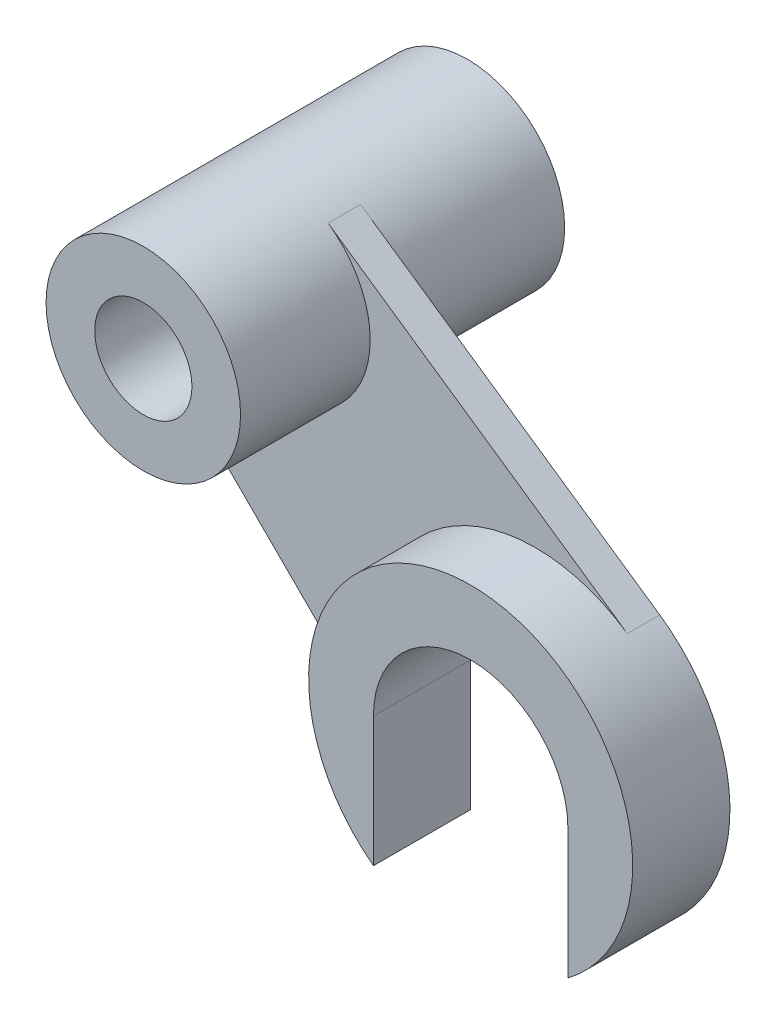
ISO-10303-21;
HEADER;
FILE_DESCRIPTION(('STEP AP214'),'2;1');
FILE_NAME('part.step','',(''),(''),'','','');
FILE_SCHEMA(('AUTOMOTIVE_DESIGN { 1 0 10303 214 1 1 1 1 }'));
ENDSEC;
DATA;
#1=APPLICATION_CONTEXT('core data for automotive mechanical design processes');
#2=APPLICATION_PROTOCOL_DEFINITION('international standard','automotive_design',2000,#1);
#3=PRODUCT_CONTEXT('',#1,'mechanical');
#4=PRODUCT('Part','Part','',(#3));
#5=PRODUCT_RELATED_PRODUCT_CATEGORY('part','',(#4));
#6=PRODUCT_DEFINITION_FORMATION('','',#4);
#7=PRODUCT_DEFINITION_CONTEXT('part definition',#1,'design');
#8=PRODUCT_DEFINITION('design','',#6,#7);
#9=PRODUCT_DEFINITION_SHAPE('','',#8);
#10=(LENGTH_UNIT() NAMED_UNIT(*) SI_UNIT(.MILLI.,.METRE.));
#11=(NAMED_UNIT(*) PLANE_ANGLE_UNIT() SI_UNIT($,.RADIAN.));
#12=(NAMED_UNIT(*) SI_UNIT($,.STERADIAN.) SOLID_ANGLE_UNIT());
#13=UNCERTAINTY_MEASURE_WITH_UNIT(LENGTH_MEASURE(1.E-05),#10,'distance_accuracy_value','');
#14=(GEOMETRIC_REPRESENTATION_CONTEXT(3) GLOBAL_UNCERTAINTY_ASSIGNED_CONTEXT((#13)) GLOBAL_UNIT_ASSIGNED_CONTEXT((#10,
#11,#12)) REPRESENTATION_CONTEXT('',''));
#15=CARTESIAN_POINT('',(0.,0.,0.));
#16=DIRECTION('',(0.,0.,1.));
#17=DIRECTION('',(1.,0.,0.));
#18=AXIS2_PLACEMENT_3D('',#15,#16,#17);
#19=CARTESIAN_POINT('',(0.,0.,50.));
#20=DIRECTION('',(0.,0.,-1.));
#21=DIRECTION('',(-1.,0.,0.));
#22=AXIS2_PLACEMENT_3D('',#19,#20,#21);
#23=CYLINDRICAL_SURFACE('',#22,30.);
#24=DIRECTION('',(0.,0.,-1.));
#25=VECTOR('',#24,1.);
#26=CARTESIAN_POINT('',(-30.,0.,10.));
#27=LINE('',#26,#25);
#28=CARTESIAN_POINT('',(-30.,0.,10.));
#29=VERTEX_POINT('',#28);
#30=CARTESIAN_POINT('',(-30.,0.,0.));
#31=VERTEX_POINT('',#30);
#32=EDGE_CURVE('E58',#29,#31,#27,.T.);
#33=ORIENTED_EDGE('',*,*,#32,.F.);
#34=CARTESIAN_POINT('',(0.,0.,10.));
#35=DIRECTION('',(0.,0.,1.));
#36=DIRECTION('',(1.,0.,0.));
#37=AXIS2_PLACEMENT_3D('',#34,#35,#36);
#38=CIRCLE('',#37,30.);
#39=CARTESIAN_POINT('',(17.0030720389095,24.7163011237453,10.));
#40=VERTEX_POINT('',#39);
#41=EDGE_CURVE('E45',#29,#40,#38,.T.);
#42=ORIENTED_EDGE('',*,*,#41,.T.);
#43=DIRECTION('',(0.,0.,-1.));
#44=VECTOR('',#43,1.);
#45=CARTESIAN_POINT('',(17.0030720389095,24.7163011237453,10.));
#46=LINE('',#45,#44);
#47=CARTESIAN_POINT('',(17.0030720389095,24.7163011237453,0.));
#48=VERTEX_POINT('',#47);
#49=EDGE_CURVE('E169',#40,#48,#46,.T.);
#50=ORIENTED_EDGE('',*,*,#49,.T.);
#51=CARTESIAN_POINT('',(0.,0.,0.));
#52=DIRECTION('',(0.,0.,1.));
#53=DIRECTION('',(1.,0.,0.));
#54=AXIS2_PLACEMENT_3D('',#51,#52,#53);
#55=CIRCLE('',#54,30.);
#56=EDGE_CURVE('E186',#31,#48,#55,.T.);
#57=ORIENTED_EDGE('',*,*,#56,.F.);
#58=EDGE_LOOP('',(#33,#42,#50,#57));
#59=FACE_BOUND('',#58,.T.);
#60=CARTESIAN_POINT('',(0.,0.,50.));
#61=DIRECTION('',(0.,0.,1.));
#62=DIRECTION('',(1.,0.,0.));
#63=AXIS2_PLACEMENT_3D('',#60,#61,#62);
#64=CIRCLE('',#63,30.);
#65=CARTESIAN_POINT('',(30.,0.,50.));
#66=VERTEX_POINT('',#65);
#67=EDGE_CURVE('E187',#66,#66,#64,.T.);
#68=ORIENTED_EDGE('',*,*,#67,.F.);
#69=EDGE_LOOP('',(#68));
#70=FACE_BOUND('',#69,.T.);
#71=CARTESIAN_POINT('',(0.,0.,-50.));
#72=DIRECTION('',(0.,0.,1.));
#73=DIRECTION('',(1.,0.,0.));
#74=AXIS2_PLACEMENT_3D('',#71,#72,#73);
#75=CIRCLE('',#74,30.);
#76=CARTESIAN_POINT('',(30.,0.,-50.));
#77=VERTEX_POINT('',#76);
#78=EDGE_CURVE('E180',#77,#77,#75,.T.);
#79=ORIENTED_EDGE('',*,*,#78,.T.);
#80=EDGE_LOOP('',(#79));
#81=FACE_BOUND('',#80,.T.);
#82=ADVANCED_FACE('F39',(#59,#70,#81),#23,.T.);
#83=CARTESIAN_POINT('',(0.,0.,50.));
#84=DIRECTION('',(0.,0.,1.));
#85=DIRECTION('',(1.,0.,0.));
#86=AXIS2_PLACEMENT_3D('',#83,#84,#85);
#87=PLANE('',#86);
#88=CARTESIAN_POINT('',(0.,0.,50.));
#89=DIRECTION('',(0.,0.,1.));
#90=DIRECTION('',(1.,0.,0.));
#91=AXIS2_PLACEMENT_3D('',#88,#89,#90);
#92=CIRCLE('',#91,15.);
#93=CARTESIAN_POINT('',(15.,0.,50.));
#94=VERTEX_POINT('',#93);
#95=EDGE_CURVE('E141',#94,#94,#92,.T.);
#96=ORIENTED_EDGE('',*,*,#95,.F.);
#97=EDGE_LOOP('',(#96));
#98=FACE_BOUND('',#97,.T.);
#99=ORIENTED_EDGE('',*,*,#67,.T.);
#100=EDGE_LOOP('',(#99));
#101=FACE_BOUND('',#100,.T.);
#102=ADVANCED_FACE('F221',(#98,#101),#87,.T.);
#103=CARTESIAN_POINT('',(0.,0.,-50.));
#104=DIRECTION('',(0.,0.,1.));
#105=DIRECTION('',(1.,0.,0.));
#106=AXIS2_PLACEMENT_3D('',#103,#104,#105);
#107=PLANE('',#106);
#108=CARTESIAN_POINT('',(0.,0.,-50.));
#109=DIRECTION('',(0.,0.,1.));
#110=DIRECTION('',(1.,0.,0.));
#111=AXIS2_PLACEMENT_3D('',#108,#109,#110);
#112=CIRCLE('',#111,15.);
#113=CARTESIAN_POINT('',(15.,0.,-50.));
#114=VERTEX_POINT('',#113);
#115=EDGE_CURVE('E148',#114,#114,#112,.T.);
#116=ORIENTED_EDGE('',*,*,#115,.T.);
#117=EDGE_LOOP('',(#116));
#118=FACE_BOUND('',#117,.T.);
#119=ORIENTED_EDGE('',*,*,#78,.F.);
#120=EDGE_LOOP('',(#119));
#121=FACE_BOUND('',#120,.T.);
#122=ADVANCED_FACE('F216',(#118,#121),#107,.F.);
#123=CARTESIAN_POINT('',(-30.,-40.,10.));
#124=DIRECTION('',(-1.,0.,0.));
#125=DIRECTION('',(0.,-1.,0.));
#126=AXIS2_PLACEMENT_3D('',#123,#124,#125);
#127=PLANE('',#126);
#128=DIRECTION('',(0.,1.,0.));
#129=VECTOR('',#128,1.);
#130=CARTESIAN_POINT('',(-30.,-40.,0.));
#131=LINE('',#130,#129);
#132=CARTESIAN_POINT('',(-30.,-40.,0.));
#133=VERTEX_POINT('',#132);
#134=EDGE_CURVE('E165',#133,#31,#131,.T.);
#135=ORIENTED_EDGE('',*,*,#134,.F.);
#136=DIRECTION('',(0.,0.,-1.));
#137=VECTOR('',#136,1.);
#138=CARTESIAN_POINT('',(-30.,-40.,10.));
#139=LINE('',#138,#137);
#140=CARTESIAN_POINT('',(-30.,-40.,10.));
#141=VERTEX_POINT('',#140);
#142=EDGE_CURVE('E176',#141,#133,#139,.T.);
#143=ORIENTED_EDGE('',*,*,#142,.F.);
#144=DIRECTION('',(0.,1.,0.));
#145=VECTOR('',#144,1.);
#146=CARTESIAN_POINT('',(-30.,-40.,10.));
#147=LINE('',#146,#145);
#148=EDGE_CURVE('E164',#141,#29,#147,.T.);
#149=ORIENTED_EDGE('',*,*,#148,.T.);
#150=ORIENTED_EDGE('',*,*,#32,.T.);
#151=EDGE_LOOP('',(#135,#143,#149,#150));
#152=FACE_BOUND('',#151,.T.);
#153=ADVANCED_FACE('F212',(#152),#127,.T.);
#154=CARTESIAN_POINT('',(45.7164473781004,-115.423743202216,10.));
#155=DIRECTION('',(-0.705736046278897,-0.708474864044329,0.));
#156=DIRECTION('',(0.708474864044329,-0.705736046278897,0.));
#157=AXIS2_PLACEMENT_3D('',#154,#155,#156);
#158=PLANE('',#157);
#159=DIRECTION('',(-0.708474864044329,0.705736046278897,0.));
#160=VECTOR('',#159,1.);
#161=CARTESIAN_POINT('',(45.7164473781004,-115.423743202216,0.));
#162=LINE('',#161,#160);
#163=CARTESIAN_POINT('',(45.7164473781005,-115.423743202216,0.));
#164=VERTEX_POINT('',#163);
#165=EDGE_CURVE('E172',#164,#133,#162,.T.);
#166=ORIENTED_EDGE('',*,*,#165,.F.);
#167=DIRECTION('',(0.,0.,-1.));
#168=VECTOR('',#167,1.);
#169=CARTESIAN_POINT('',(45.7164473781004,-115.423743202216,10.));
#170=LINE('',#169,#168);
#171=CARTESIAN_POINT('',(45.7164473781005,-115.423743202216,10.));
#172=VERTEX_POINT('',#171);
#173=EDGE_CURVE('E177',#172,#164,#170,.T.);
#174=ORIENTED_EDGE('',*,*,#173,.F.);
#175=DIRECTION('',(-0.708474864044329,0.705736046278897,0.));
#176=VECTOR('',#175,1.);
#177=CARTESIAN_POINT('',(45.7164473781004,-115.423743202216,10.));
#178=LINE('',#177,#176);
#179=EDGE_CURVE('E161',#172,#141,#178,.T.);
#180=ORIENTED_EDGE('',*,*,#179,.T.);
#181=ORIENTED_EDGE('',*,*,#142,.T.);
#182=EDGE_LOOP('',(#166,#174,#180,#181));
#183=FACE_BOUND('',#182,.T.);
#184=ADVANCED_FACE('F207',(#183),#158,.T.);
#185=CARTESIAN_POINT('',(17.0030720389095,24.7163011237453,10.));
#186=DIRECTION('',(0.566769067963651,0.823876704124843,0.));
#187=DIRECTION('',(-0.823876704124843,0.566769067963651,0.));
#188=AXIS2_PLACEMENT_3D('',#185,#186,#187);
#189=PLANE('',#188);
#190=DIRECTION('',(0.823876704124843,-0.566769067963651,0.));
#191=VECTOR('',#190,1.);
#192=CARTESIAN_POINT('',(17.0030720389095,24.7163011237453,0.));
#193=LINE('',#192,#191);
#194=CARTESIAN_POINT('',(109.341703090228,-38.8061647937579,0.));
#195=VERTEX_POINT('',#194);
#196=EDGE_CURVE('E160',#48,#195,#193,.T.);
#197=ORIENTED_EDGE('',*,*,#196,.F.);
#198=ORIENTED_EDGE('',*,*,#49,.F.);
#199=DIRECTION('',(0.823876704124843,-0.566769067963651,0.));
#200=VECTOR('',#199,1.);
#201=CARTESIAN_POINT('',(17.0030720389095,24.7163011237453,10.));
#202=LINE('',#201,#200);
#203=CARTESIAN_POINT('',(109.341703090228,-38.8061647937578,10.));
#204=VERTEX_POINT('',#203);
#205=EDGE_CURVE('E158',#40,#204,#202,.T.);
#206=ORIENTED_EDGE('',*,*,#205,.T.);
#207=DIRECTION('',(0.,0.,-1.));
#208=VECTOR('',#207,1.);
#209=CARTESIAN_POINT('',(109.341703090228,-38.8061647937578,10.));
#210=LINE('',#209,#208);
#211=EDGE_CURVE('E185',#204,#195,#210,.T.);
#212=ORIENTED_EDGE('',*,*,#211,.T.);
#213=EDGE_LOOP('',(#197,#198,#206,#212));
#214=FACE_BOUND('',#213,.T.);
#215=ADVANCED_FACE('F199',(#214),#189,.T.);
#216=CARTESIAN_POINT('',(0.,0.,10.));
#217=DIRECTION('',(0.,0.,1.));
#218=DIRECTION('',(1.,0.,0.));
#219=AXIS2_PLACEMENT_3D('',#216,#217,#218);
#220=PLANE('',#219);
#221=ORIENTED_EDGE('',*,*,#179,.F.);
#222=CARTESIAN_POINT('',(81.0032496920453,-80.,10.));
#223=DIRECTION('',(0.,0.,1.));
#224=DIRECTION('',(1.,0.,0.));
#225=AXIS2_PLACEMENT_3D('',#222,#223,#224);
#226=CIRCLE('',#225,50.);
#227=EDGE_CURVE('E151',#172,#204,#226,.F.);
#228=ORIENTED_EDGE('',*,*,#227,.T.);
#229=ORIENTED_EDGE('',*,*,#205,.F.);
#230=ORIENTED_EDGE('',*,*,#41,.F.);
#231=ORIENTED_EDGE('',*,*,#148,.F.);
#232=EDGE_LOOP('',(#221,#228,#229,#230,#231));
#233=FACE_BOUND('',#232,.T.);
#234=ADVANCED_FACE('F205',(#233),#220,.T.);
#235=CARTESIAN_POINT('',(0.,0.,0.));
#236=DIRECTION('',(0.,0.,1.));
#237=DIRECTION('',(1.,0.,0.));
#238=AXIS2_PLACEMENT_3D('',#235,#236,#237);
#239=PLANE('',#238);
#240=CARTESIAN_POINT('',(81.0032496920453,-80.,0.));
#241=DIRECTION('',(0.,0.,1.));
#242=DIRECTION('',(1.,0.,0.));
#243=AXIS2_PLACEMENT_3D('',#240,#241,#242);
#244=CIRCLE('',#243,50.);
#245=CARTESIAN_POINT('',(111.003249692045,-120.,0.));
#246=VERTEX_POINT('',#245);
#247=EDGE_CURVE('E149',#246,#195,#244,.T.);
#248=ORIENTED_EDGE('',*,*,#247,.F.);
#249=DIRECTION('',(0.,1.,0.));
#250=VECTOR('',#249,1.);
#251=CARTESIAN_POINT('',(111.003249692045,0.,0.));
#252=LINE('',#251,#250);
#253=CARTESIAN_POINT('',(111.003249692045,-80.,0.));
#254=VERTEX_POINT('',#253);
#255=EDGE_CURVE('E136',#246,#254,#252,.T.);
#256=ORIENTED_EDGE('',*,*,#255,.T.);
#257=CARTESIAN_POINT('',(81.0032496920453,-80.,0.));
#258=DIRECTION('',(0.,0.,1.));
#259=DIRECTION('',(1.,0.,0.));
#260=AXIS2_PLACEMENT_3D('',#257,#258,#259);
#261=CIRCLE('',#260,30.);
#262=CARTESIAN_POINT('',(51.0032496920453,-80.,0.));
#263=VERTEX_POINT('',#262);
#264=EDGE_CURVE('E143',#254,#263,#261,.T.);
#265=ORIENTED_EDGE('',*,*,#264,.T.);
#266=DIRECTION('',(0.,-1.,0.));
#267=VECTOR('',#266,1.);
#268=CARTESIAN_POINT('',(51.0032496920453,0.,0.));
#269=LINE('',#268,#267);
#270=CARTESIAN_POINT('',(51.0032496920453,-120.,0.));
#271=VERTEX_POINT('',#270);
#272=EDGE_CURVE('E113',#263,#271,#269,.T.);
#273=ORIENTED_EDGE('',*,*,#272,.T.);
#274=EDGE_CURVE('E155',#164,#271,#244,.T.);
#275=ORIENTED_EDGE('',*,*,#274,.F.);
#276=ORIENTED_EDGE('',*,*,#165,.T.);
#277=ORIENTED_EDGE('',*,*,#134,.T.);
#278=ORIENTED_EDGE('',*,*,#56,.T.);
#279=ORIENTED_EDGE('',*,*,#196,.T.);
#280=EDGE_LOOP('',(#248,#256,#265,#273,#275,#276,#277,#278,#279));
#281=FACE_BOUND('',#280,.T.);
#282=ADVANCED_FACE('F215',(#281),#239,.F.);
#283=CARTESIAN_POINT('',(81.0032496920453,-80.,30.));
#284=DIRECTION('',(0.,0.,-1.));
#285=DIRECTION('',(-1.,0.,0.));
#286=AXIS2_PLACEMENT_3D('',#283,#284,#285);
#287=CYLINDRICAL_SURFACE('',#286,50.);
#288=CARTESIAN_POINT('',(81.0032496920453,-80.,30.));
#289=DIRECTION('',(0.,0.,1.));
#290=DIRECTION('',(1.,0.,0.));
#291=AXIS2_PLACEMENT_3D('',#288,#289,#290);
#292=CIRCLE('',#291,50.);
#293=CARTESIAN_POINT('',(111.003249692045,-120.,30.));
#294=VERTEX_POINT('',#293);
#295=CARTESIAN_POINT('',(51.0032496920453,-120.,30.));
#296=VERTEX_POINT('',#295);
#297=EDGE_CURVE('E126',#294,#296,#292,.T.);
#298=ORIENTED_EDGE('',*,*,#297,.F.);
#299=DIRECTION('',(0.,0.,-1.));
#300=VECTOR('',#299,1.);
#301=CARTESIAN_POINT('',(111.003249692045,-120.,30.));
#302=LINE('',#301,#300);
#303=EDGE_CURVE('E133',#294,#246,#302,.T.);
#304=ORIENTED_EDGE('',*,*,#303,.T.);
#305=ORIENTED_EDGE('',*,*,#247,.T.);
#306=ORIENTED_EDGE('',*,*,#211,.F.);
#307=ORIENTED_EDGE('',*,*,#227,.F.);
#308=ORIENTED_EDGE('',*,*,#173,.T.);
#309=ORIENTED_EDGE('',*,*,#274,.T.);
#310=DIRECTION('',(0.,0.,-1.));
#311=VECTOR('',#310,1.);
#312=CARTESIAN_POINT('',(51.0032496920453,-120.,30.));
#313=LINE('',#312,#311);
#314=EDGE_CURVE('E132',#271,#296,#313,.F.);
#315=ORIENTED_EDGE('',*,*,#314,.T.);
#316=EDGE_LOOP('',(#298,#304,#305,#306,#307,#308,#309,#315));
#317=FACE_BOUND('',#316,.T.);
#318=ADVANCED_FACE('F202',(#317),#287,.T.);
#319=CARTESIAN_POINT('',(81.0032496920453,-80.,30.));
#320=DIRECTION('',(0.,0.,1.));
#321=DIRECTION('',(1.,0.,0.));
#322=AXIS2_PLACEMENT_3D('',#319,#320,#321);
#323=PLANE('',#322);
#324=DIRECTION('',(0.,-1.,0.));
#325=VECTOR('',#324,1.);
#326=CARTESIAN_POINT('',(51.0032496920453,-80.,30.));
#327=LINE('',#326,#325);
#328=CARTESIAN_POINT('',(51.0032496920453,-80.,30.));
#329=VERTEX_POINT('',#328);
#330=EDGE_CURVE('E115',#329,#296,#327,.T.);
#331=ORIENTED_EDGE('',*,*,#330,.F.);
#332=CARTESIAN_POINT('',(81.0032496920453,-80.,30.));
#333=DIRECTION('',(0.,0.,1.));
#334=DIRECTION('',(1.,0.,0.));
#335=AXIS2_PLACEMENT_3D('',#332,#333,#334);
#336=CIRCLE('',#335,30.);
#337=CARTESIAN_POINT('',(111.003249692045,-80.,30.));
#338=VERTEX_POINT('',#337);
#339=EDGE_CURVE('E123',#338,#329,#336,.T.);
#340=ORIENTED_EDGE('',*,*,#339,.F.);
#341=DIRECTION('',(0.,1.,0.));
#342=VECTOR('',#341,1.);
#343=CARTESIAN_POINT('',(111.003249692045,-80.,30.));
#344=LINE('',#343,#342);
#345=EDGE_CURVE('E11',#294,#338,#344,.T.);
#346=ORIENTED_EDGE('',*,*,#345,.F.);
#347=ORIENTED_EDGE('',*,*,#297,.T.);
#348=EDGE_LOOP('',(#331,#340,#346,#347));
#349=FACE_BOUND('',#348,.T.);
#350=ADVANCED_FACE('F127',(#349),#323,.T.);
#351=CARTESIAN_POINT('',(0.,0.,50.));
#352=DIRECTION('',(0.,0.,1.));
#353=DIRECTION('',(1.,0.,0.));
#354=AXIS2_PLACEMENT_3D('',#351,#352,#353);
#355=CYLINDRICAL_SURFACE('',#354,15.);
#356=ORIENTED_EDGE('',*,*,#115,.F.);
#357=EDGE_LOOP('',(#356));
#358=FACE_BOUND('',#357,.T.);
#359=ORIENTED_EDGE('',*,*,#95,.T.);
#360=EDGE_LOOP('',(#359));
#361=FACE_BOUND('',#360,.T.);
#362=ADVANCED_FACE('F247',(#358,#361),#355,.F.);
#363=CARTESIAN_POINT('',(81.0032496920453,-80.,-50.));
#364=DIRECTION('',(0.,0.,1.));
#365=DIRECTION('',(1.,0.,0.));
#366=AXIS2_PLACEMENT_3D('',#363,#364,#365);
#367=CYLINDRICAL_SURFACE('',#366,30.);
#368=DIRECTION('',(0.,0.,1.));
#369=VECTOR('',#368,1.);
#370=CARTESIAN_POINT('',(111.003249692045,-80.,-50.));
#371=LINE('',#370,#369);
#372=EDGE_CURVE('E119',#254,#338,#371,.T.);
#373=ORIENTED_EDGE('',*,*,#372,.T.);
#374=ORIENTED_EDGE('',*,*,#339,.T.);
#375=DIRECTION('',(0.,0.,1.));
#376=VECTOR('',#375,1.);
#377=CARTESIAN_POINT('',(51.0032496920453,-80.,-50.));
#378=LINE('',#377,#376);
#379=EDGE_CURVE('E107',#263,#329,#378,.T.);
#380=ORIENTED_EDGE('',*,*,#379,.F.);
#381=ORIENTED_EDGE('',*,*,#264,.F.);
#382=EDGE_LOOP('',(#373,#374,#380,#381));
#383=FACE_BOUND('',#382,.T.);
#384=ADVANCED_FACE('F125',(#383),#367,.F.);
#385=CARTESIAN_POINT('',(111.003249692045,-80.,-50.));
#386=DIRECTION('',(1.,0.,0.));
#387=DIRECTION('',(0.,0.,-1.));
#388=AXIS2_PLACEMENT_3D('',#385,#386,#387);
#389=PLANE('',#388);
#390=ORIENTED_EDGE('',*,*,#303,.F.);
#391=ORIENTED_EDGE('',*,*,#345,.T.);
#392=ORIENTED_EDGE('',*,*,#372,.F.);
#393=ORIENTED_EDGE('',*,*,#255,.F.);
#394=EDGE_LOOP('',(#390,#391,#392,#393));
#395=FACE_BOUND('',#394,.T.);
#396=ADVANCED_FACE('F258',(#395),#389,.F.);
#397=CARTESIAN_POINT('',(51.0032496920453,-80.,-50.));
#398=DIRECTION('',(-1.,0.,0.));
#399=DIRECTION('',(0.,-1.,0.));
#400=AXIS2_PLACEMENT_3D('',#397,#398,#399);
#401=PLANE('',#400);
#402=ORIENTED_EDGE('',*,*,#379,.T.);
#403=ORIENTED_EDGE('',*,*,#330,.T.);
#404=ORIENTED_EDGE('',*,*,#314,.F.);
#405=ORIENTED_EDGE('',*,*,#272,.F.);
#406=EDGE_LOOP('',(#402,#403,#404,#405));
#407=FACE_BOUND('',#406,.T.);
#408=ADVANCED_FACE('F109',(#407),#401,.F.);
#409=CLOSED_SHELL('',(#82,#102,#122,#153,#184,#215,#234,#282,#318,#350,#362,#384,#396,#408));
#410=MANIFOLD_SOLID_BREP('B2',#409);
#411=ADVANCED_BREP_SHAPE_REPRESENTATION('',(#18,#410),#14);
#412=SHAPE_DEFINITION_REPRESENTATION(#9,#411);
ENDSEC;
END-ISO-10303-21;
